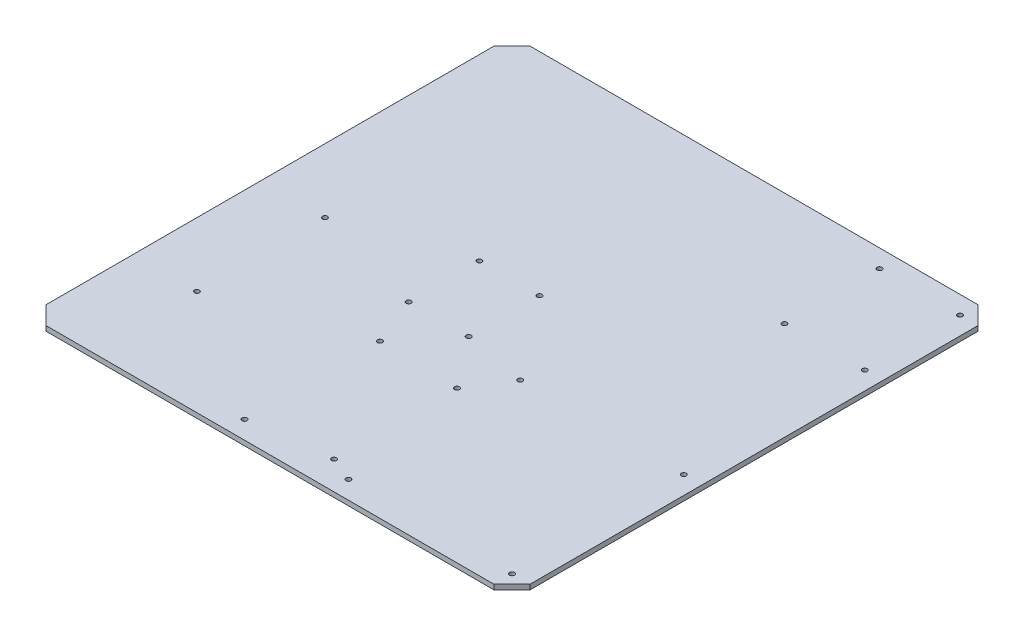
ISO-10303-21;
HEADER;
FILE_DESCRIPTION(('STEP AP214'),'2;1');
FILE_NAME('part.step','',(''),(''),'','','');
FILE_SCHEMA(('AUTOMOTIVE_DESIGN { 1 0 10303 214 1 1 1 1 }'));
ENDSEC;
DATA;
#1=APPLICATION_CONTEXT('core data for automotive mechanical design processes');
#2=APPLICATION_PROTOCOL_DEFINITION('international standard','automotive_design',2000,#1);
#3=PRODUCT_CONTEXT('',#1,'mechanical');
#4=PRODUCT('Part','Part','',(#3));
#5=PRODUCT_RELATED_PRODUCT_CATEGORY('part','',(#4));
#6=PRODUCT_DEFINITION_FORMATION('','',#4);
#7=PRODUCT_DEFINITION_CONTEXT('part definition',#1,'design');
#8=PRODUCT_DEFINITION('design','',#6,#7);
#9=PRODUCT_DEFINITION_SHAPE('','',#8);
#10=(LENGTH_UNIT() NAMED_UNIT(*) SI_UNIT(.MILLI.,.METRE.));
#11=(NAMED_UNIT(*) PLANE_ANGLE_UNIT() SI_UNIT($,.RADIAN.));
#12=(NAMED_UNIT(*) SI_UNIT($,.STERADIAN.) SOLID_ANGLE_UNIT());
#13=UNCERTAINTY_MEASURE_WITH_UNIT(LENGTH_MEASURE(1.E-05),#10,'distance_accuracy_value','');
#14=(GEOMETRIC_REPRESENTATION_CONTEXT(3) GLOBAL_UNCERTAINTY_ASSIGNED_CONTEXT((#13)) GLOBAL_UNIT_ASSIGNED_CONTEXT((#10,
#11,#12)) REPRESENTATION_CONTEXT('',''));
#15=CARTESIAN_POINT('',(0.,0.,0.));
#16=DIRECTION('',(0.,0.,1.));
#17=DIRECTION('',(1.,0.,0.));
#18=AXIS2_PLACEMENT_3D('',#15,#16,#17);
#19=CARTESIAN_POINT('',(0.,1.5,0.));
#20=DIRECTION('',(0.,-1.,0.));
#21=DIRECTION('',(0.,0.,-1.));
#22=AXIS2_PLACEMENT_3D('',#19,#20,#21);
#23=PLANE('',#22);
#24=DIRECTION('',(0.,0.,1.));
#25=VECTOR('',#24,1.);
#26=CARTESIAN_POINT('',(-147.5,1.5,136.500000000001));
#27=LINE('',#26,#25);
#28=CARTESIAN_POINT('',(-147.5,1.5,-136.500000000001));
#29=VERTEX_POINT('',#28);
#30=CARTESIAN_POINT('',(-147.5,1.5,136.500000000001));
#31=VERTEX_POINT('',#30);
#32=EDGE_CURVE('E172',#29,#31,#27,.T.);
#33=ORIENTED_EDGE('',*,*,#32,.T.);
#34=DIRECTION('',(0.707106781186548,0.,0.707106781186548));
#35=VECTOR('',#34,1.);
#36=CARTESIAN_POINT('',(-147.5,1.5,136.500000000001));
#37=LINE('',#36,#35);
#38=CARTESIAN_POINT('',(-136.5,1.5,147.500000000001));
#39=VERTEX_POINT('',#38);
#40=EDGE_CURVE('E206',#31,#39,#37,.T.);
#41=ORIENTED_EDGE('',*,*,#40,.T.);
#42=DIRECTION('',(1.,0.,0.));
#43=VECTOR('',#42,1.);
#44=CARTESIAN_POINT('',(-136.5,1.5,147.500000000001));
#45=LINE('',#44,#43);
#46=CARTESIAN_POINT('',(136.5,1.5,147.500000000001));
#47=VERTEX_POINT('',#46);
#48=EDGE_CURVE('E192',#39,#47,#45,.T.);
#49=ORIENTED_EDGE('',*,*,#48,.T.);
#50=DIRECTION('',(0.707106781186547,0.,-0.707106781186548));
#51=VECTOR('',#50,1.);
#52=CARTESIAN_POINT('',(147.5,1.5,136.500000000001));
#53=LINE('',#52,#51);
#54=CARTESIAN_POINT('',(147.5,1.5,136.500000000001));
#55=VERTEX_POINT('',#54);
#56=EDGE_CURVE('E138',#47,#55,#53,.T.);
#57=ORIENTED_EDGE('',*,*,#56,.T.);
#58=DIRECTION('',(0.,0.,-1.));
#59=VECTOR('',#58,1.);
#60=CARTESIAN_POINT('',(147.5,1.5,136.500000000001));
#61=LINE('',#60,#59);
#62=CARTESIAN_POINT('',(147.5,1.5,-136.500000000001));
#63=VERTEX_POINT('',#62);
#64=EDGE_CURVE('E133',#55,#63,#61,.T.);
#65=ORIENTED_EDGE('',*,*,#64,.T.);
#66=DIRECTION('',(-0.707106781186548,0.,-0.707106781186548));
#67=VECTOR('',#66,1.);
#68=CARTESIAN_POINT('',(136.5,1.5,-147.500000000001));
#69=LINE('',#68,#67);
#70=CARTESIAN_POINT('',(136.5,1.5,-147.500000000001));
#71=VERTEX_POINT('',#70);
#72=EDGE_CURVE('E113',#63,#71,#69,.T.);
#73=ORIENTED_EDGE('',*,*,#72,.T.);
#74=DIRECTION('',(-1.,0.,0.));
#75=VECTOR('',#74,1.);
#76=CARTESIAN_POINT('',(-136.5,1.5,-147.500000000001));
#77=LINE('',#76,#75);
#78=CARTESIAN_POINT('',(-136.5,1.5,-147.500000000001));
#79=VERTEX_POINT('',#78);
#80=EDGE_CURVE('E123',#71,#79,#77,.T.);
#81=ORIENTED_EDGE('',*,*,#80,.T.);
#82=DIRECTION('',(-0.707106781186547,0.,0.707106781186547));
#83=VECTOR('',#82,1.);
#84=CARTESIAN_POINT('',(-147.5,1.5,-136.500000000001));
#85=LINE('',#84,#83);
#86=EDGE_CURVE('E127',#79,#29,#85,.T.);
#87=ORIENTED_EDGE('',*,*,#86,.T.);
#88=EDGE_LOOP('',(#33,#41,#49,#57,#65,#73,#81,#87));
#89=FACE_BOUND('',#88,.T.);
#90=CARTESIAN_POINT('',(-26.5,1.5,136.500000000001));
#91=DIRECTION('',(0.,1.,0.));
#92=DIRECTION('',(0.,0.,1.));
#93=AXIS2_PLACEMENT_3D('',#90,#91,#92);
#94=CIRCLE('',#93,1.5);
#95=CARTESIAN_POINT('',(-26.5,1.5,138.000000000001));
#96=VERTEX_POINT('',#95);
#97=EDGE_CURVE('E148',#96,#96,#94,.T.);
#98=ORIENTED_EDGE('',*,*,#97,.F.);
#99=EDGE_LOOP('',(#98));
#100=FACE_BOUND('',#99,.T.);
#101=CARTESIAN_POINT('',(-26.5,1.5,54.000000000001));
#102=DIRECTION('',(0.,1.,0.));
#103=DIRECTION('',(0.,0.,1.));
#104=AXIS2_PLACEMENT_3D('',#101,#102,#103);
#105=CIRCLE('',#104,1.5);
#106=CARTESIAN_POINT('',(-26.5,1.5,55.500000000001));
#107=VERTEX_POINT('',#106);
#108=EDGE_CURVE('E219',#107,#107,#105,.T.);
#109=ORIENTED_EDGE('',*,*,#108,.F.);
#110=EDGE_LOOP('',(#109));
#111=FACE_BOUND('',#110,.T.);
#112=CARTESIAN_POINT('',(21.7999999999999,1.5,55.3000000000009));
#113=DIRECTION('',(0.,1.,0.));
#114=DIRECTION('',(0.,0.,1.));
#115=AXIS2_PLACEMENT_3D('',#112,#113,#114);
#116=CIRCLE('',#115,1.5);
#117=CARTESIAN_POINT('',(21.7999999999999,1.5,56.8000000000009));
#118=VERTEX_POINT('',#117);
#119=EDGE_CURVE('E227',#118,#118,#116,.T.);
#120=ORIENTED_EDGE('',*,*,#119,.F.);
#121=EDGE_LOOP('',(#120));
#122=FACE_BOUND('',#121,.T.);
#123=CARTESIAN_POINT('',(21.7999999999999,1.5,130.200000000001));
#124=DIRECTION('',(0.,1.,0.));
#125=DIRECTION('',(0.,0.,1.));
#126=AXIS2_PLACEMENT_3D('',#123,#124,#125);
#127=CIRCLE('',#126,1.5);
#128=CARTESIAN_POINT('',(21.7999999999999,1.5,131.700000000001));
#129=VERTEX_POINT('',#128);
#130=EDGE_CURVE('E235',#129,#129,#127,.T.);
#131=ORIENTED_EDGE('',*,*,#130,.F.);
#132=EDGE_LOOP('',(#131));
#133=FACE_BOUND('',#132,.T.);
#134=CARTESIAN_POINT('',(-108.5,1.5,5.49999999999996));
#135=DIRECTION('',(0.,1.,0.));
#136=DIRECTION('',(0.,0.,1.));
#137=AXIS2_PLACEMENT_3D('',#134,#135,#136);
#138=CIRCLE('',#137,1.5);
#139=CARTESIAN_POINT('',(-108.5,1.5,6.99999999999996));
#140=VERTEX_POINT('',#139);
#141=EDGE_CURVE('E243',#140,#140,#138,.T.);
#142=ORIENTED_EDGE('',*,*,#141,.F.);
#143=EDGE_LOOP('',(#142));
#144=FACE_BOUND('',#143,.T.);
#145=CARTESIAN_POINT('',(-108.5,1.5,83.5));
#146=DIRECTION('',(0.,1.,0.));
#147=DIRECTION('',(0.,0.,1.));
#148=AXIS2_PLACEMENT_3D('',#145,#146,#147);
#149=CIRCLE('',#148,1.5);
#150=CARTESIAN_POINT('',(-108.5,1.5,85.));
#151=VERTEX_POINT('',#150);
#152=EDGE_CURVE('E251',#151,#151,#149,.T.);
#153=ORIENTED_EDGE('',*,*,#152,.F.);
#154=EDGE_LOOP('',(#153));
#155=FACE_BOUND('',#154,.T.);
#156=CARTESIAN_POINT('',(-38.5,1.5,24.500000000001));
#157=DIRECTION('',(0.,1.,0.));
#158=DIRECTION('',(0.,0.,1.));
#159=AXIS2_PLACEMENT_3D('',#156,#157,#158);
#160=CIRCLE('',#159,1.5);
#161=CARTESIAN_POINT('',(-38.5,1.5,26.000000000001));
#162=VERTEX_POINT('',#161);
#163=EDGE_CURVE('E259',#162,#162,#160,.T.);
#164=ORIENTED_EDGE('',*,*,#163,.F.);
#165=EDGE_LOOP('',(#164));
#166=FACE_BOUND('',#165,.T.);
#167=CARTESIAN_POINT('',(-1.92000000000005,1.5,-18.679999999999));
#168=DIRECTION('',(0.,1.,0.));
#169=DIRECTION('',(0.,0.,1.));
#170=AXIS2_PLACEMENT_3D('',#167,#168,#169);
#171=CIRCLE('',#170,1.5);
#172=CARTESIAN_POINT('',(-1.92000000000005,1.5,-17.179999999999));
#173=VERTEX_POINT('',#172);
#174=EDGE_CURVE('E267',#173,#173,#171,.T.);
#175=ORIENTED_EDGE('',*,*,#174,.F.);
#176=EDGE_LOOP('',(#175));
#177=FACE_BOUND('',#176,.T.);
#178=CARTESIAN_POINT('',(-38.5,1.5,-18.679999999999));
#179=DIRECTION('',(0.,1.,0.));
#180=DIRECTION('',(0.,0.,1.));
#181=AXIS2_PLACEMENT_3D('',#178,#179,#180);
#182=CIRCLE('',#181,1.5);
#183=CARTESIAN_POINT('',(-38.5,1.5,-17.179999999999));
#184=VERTEX_POINT('',#183);
#185=EDGE_CURVE('E275',#184,#184,#182,.T.);
#186=ORIENTED_EDGE('',*,*,#185,.F.);
#187=EDGE_LOOP('',(#186));
#188=FACE_BOUND('',#187,.T.);
#189=CARTESIAN_POINT('',(-1.92000000000005,1.5,24.500000000001));
#190=DIRECTION('',(0.,1.,0.));
#191=DIRECTION('',(0.,0.,1.));
#192=AXIS2_PLACEMENT_3D('',#189,#190,#191);
#193=CIRCLE('',#192,1.5);
#194=CARTESIAN_POINT('',(-1.92000000000005,1.5,26.000000000001));
#195=VERTEX_POINT('',#194);
#196=EDGE_CURVE('E283',#195,#195,#193,.T.);
#197=ORIENTED_EDGE('',*,*,#196,.F.);
#198=EDGE_LOOP('',(#197));
#199=FACE_BOUND('',#198,.T.);
#200=CARTESIAN_POINT('',(136.5,1.5,-136.500000000001));
#201=DIRECTION('',(0.,1.,0.));
#202=DIRECTION('',(0.,0.,1.));
#203=AXIS2_PLACEMENT_3D('',#200,#201,#202);
#204=CIRCLE('',#203,1.5);
#205=CARTESIAN_POINT('',(136.5,1.5,-135.000000000001));
#206=VERTEX_POINT('',#205);
#207=EDGE_CURVE('E291',#206,#206,#204,.T.);
#208=ORIENTED_EDGE('',*,*,#207,.F.);
#209=EDGE_LOOP('',(#208));
#210=FACE_BOUND('',#209,.T.);
#211=CARTESIAN_POINT('',(87.4999999999999,1.5,-136.500000000001));
#212=DIRECTION('',(0.,1.,0.));
#213=DIRECTION('',(0.,0.,1.));
#214=AXIS2_PLACEMENT_3D('',#211,#212,#213);
#215=CIRCLE('',#214,1.4999999999998);
#216=CARTESIAN_POINT('',(87.4999999999999,1.5,-135.000000000001));
#217=VERTEX_POINT('',#216);
#218=EDGE_CURVE('E299',#217,#217,#215,.T.);
#219=ORIENTED_EDGE('',*,*,#218,.F.);
#220=EDGE_LOOP('',(#219));
#221=FACE_BOUND('',#220,.T.);
#222=CARTESIAN_POINT('',(87.4999999999999,1.5,-78.500000000001));
#223=DIRECTION('',(0.,1.,0.));
#224=DIRECTION('',(0.,0.,1.));
#225=AXIS2_PLACEMENT_3D('',#222,#223,#224);
#226=CIRCLE('',#225,1.4999999999998);
#227=CARTESIAN_POINT('',(87.4999999999999,1.5,-77.0000000000013));
#228=VERTEX_POINT('',#227);
#229=EDGE_CURVE('E307',#228,#228,#226,.T.);
#230=ORIENTED_EDGE('',*,*,#229,.F.);
#231=EDGE_LOOP('',(#230));
#232=FACE_BOUND('',#231,.T.);
#233=CARTESIAN_POINT('',(136.5,1.5,-78.500000000001));
#234=DIRECTION('',(0.,1.,0.));
#235=DIRECTION('',(0.,0.,1.));
#236=AXIS2_PLACEMENT_3D('',#233,#234,#235);
#237=CIRCLE('',#236,1.5);
#238=CARTESIAN_POINT('',(136.5,1.5,-77.000000000001));
#239=VERTEX_POINT('',#238);
#240=EDGE_CURVE('E315',#239,#239,#237,.T.);
#241=ORIENTED_EDGE('',*,*,#240,.F.);
#242=EDGE_LOOP('',(#241));
#243=FACE_BOUND('',#242,.T.);
#244=CARTESIAN_POINT('',(136.5,1.5,136.500000000001));
#245=DIRECTION('',(0.,1.,0.));
#246=DIRECTION('',(0.,0.,1.));
#247=AXIS2_PLACEMENT_3D('',#244,#245,#246);
#248=CIRCLE('',#247,1.5);
#249=CARTESIAN_POINT('',(136.5,1.5,138.000000000001));
#250=VERTEX_POINT('',#249);
#251=EDGE_CURVE('E323',#250,#250,#248,.T.);
#252=ORIENTED_EDGE('',*,*,#251,.F.);
#253=EDGE_LOOP('',(#252));
#254=FACE_BOUND('',#253,.T.);
#255=CARTESIAN_POINT('',(36.7999999999999,1.5,136.500000000001));
#256=DIRECTION('',(0.,1.,0.));
#257=DIRECTION('',(0.,0.,1.));
#258=AXIS2_PLACEMENT_3D('',#255,#256,#257);
#259=CIRCLE('',#258,1.5);
#260=CARTESIAN_POINT('',(36.7999999999999,1.5,138.000000000001));
#261=VERTEX_POINT('',#260);
#262=EDGE_CURVE('E331',#261,#261,#259,.T.);
#263=ORIENTED_EDGE('',*,*,#262,.F.);
#264=EDGE_LOOP('',(#263));
#265=FACE_BOUND('',#264,.T.);
#266=CARTESIAN_POINT('',(36.7999999999999,1.5,31.800000000001));
#267=DIRECTION('',(0.,1.,0.));
#268=DIRECTION('',(0.,0.,1.));
#269=AXIS2_PLACEMENT_3D('',#266,#267,#268);
#270=CIRCLE('',#269,1.5);
#271=CARTESIAN_POINT('',(36.7999999999999,1.5,33.3000000000009));
#272=VERTEX_POINT('',#271);
#273=EDGE_CURVE('E339',#272,#272,#270,.T.);
#274=ORIENTED_EDGE('',*,*,#273,.F.);
#275=EDGE_LOOP('',(#274));
#276=FACE_BOUND('',#275,.T.);
#277=CARTESIAN_POINT('',(136.5,1.5,31.800000000001));
#278=DIRECTION('',(0.,1.,0.));
#279=DIRECTION('',(0.,0.,1.));
#280=AXIS2_PLACEMENT_3D('',#277,#278,#279);
#281=CIRCLE('',#280,1.5);
#282=CARTESIAN_POINT('',(136.5,1.5,33.3000000000009));
#283=VERTEX_POINT('',#282);
#284=EDGE_CURVE('E347',#283,#283,#281,.T.);
#285=ORIENTED_EDGE('',*,*,#284,.F.);
#286=EDGE_LOOP('',(#285));
#287=FACE_BOUND('',#286,.T.);
#288=ADVANCED_FACE('F41',(#89,#100,#111,#122,#133,#144,#155,#166,#177,#188,#199,#210,#221,#232,
#243,#254,#265,#276,#287),#23,.F.);
#289=CARTESIAN_POINT('',(0.,-1.5,0.));
#290=DIRECTION('',(0.,-1.,0.));
#291=DIRECTION('',(0.,0.,-1.));
#292=AXIS2_PLACEMENT_3D('',#289,#290,#291);
#293=PLANE('',#292);
#294=CARTESIAN_POINT('',(36.7999999999999,-1.5,31.800000000001));
#295=DIRECTION('',(0.,1.,0.));
#296=DIRECTION('',(0.,0.,1.));
#297=AXIS2_PLACEMENT_3D('',#294,#295,#296);
#298=CIRCLE('',#297,1.5);
#299=CARTESIAN_POINT('',(36.7999999999999,-1.5,33.3000000000009));
#300=VERTEX_POINT('',#299);
#301=EDGE_CURVE('E343',#300,#300,#298,.T.);
#302=ORIENTED_EDGE('',*,*,#301,.T.);
#303=EDGE_LOOP('',(#302));
#304=FACE_BOUND('',#303,.T.);
#305=CARTESIAN_POINT('',(136.5,-1.5,136.500000000001));
#306=DIRECTION('',(0.,1.,0.));
#307=DIRECTION('',(0.,0.,1.));
#308=AXIS2_PLACEMENT_3D('',#305,#306,#307);
#309=CIRCLE('',#308,1.5);
#310=CARTESIAN_POINT('',(136.5,-1.5,138.000000000001));
#311=VERTEX_POINT('',#310);
#312=EDGE_CURVE('E327',#311,#311,#309,.T.);
#313=ORIENTED_EDGE('',*,*,#312,.T.);
#314=EDGE_LOOP('',(#313));
#315=FACE_BOUND('',#314,.T.);
#316=CARTESIAN_POINT('',(87.4999999999999,-1.5,-78.500000000001));
#317=DIRECTION('',(0.,1.,0.));
#318=DIRECTION('',(0.,0.,1.));
#319=AXIS2_PLACEMENT_3D('',#316,#317,#318);
#320=CIRCLE('',#319,1.4999999999998);
#321=CARTESIAN_POINT('',(87.4999999999999,-1.5,-77.0000000000013));
#322=VERTEX_POINT('',#321);
#323=EDGE_CURVE('E311',#322,#322,#320,.T.);
#324=ORIENTED_EDGE('',*,*,#323,.T.);
#325=EDGE_LOOP('',(#324));
#326=FACE_BOUND('',#325,.T.);
#327=CARTESIAN_POINT('',(136.5,-1.5,-136.500000000001));
#328=DIRECTION('',(0.,1.,0.));
#329=DIRECTION('',(0.,0.,1.));
#330=AXIS2_PLACEMENT_3D('',#327,#328,#329);
#331=CIRCLE('',#330,1.5);
#332=CARTESIAN_POINT('',(136.5,-1.5,-135.000000000001));
#333=VERTEX_POINT('',#332);
#334=EDGE_CURVE('E295',#333,#333,#331,.T.);
#335=ORIENTED_EDGE('',*,*,#334,.T.);
#336=EDGE_LOOP('',(#335));
#337=FACE_BOUND('',#336,.T.);
#338=CARTESIAN_POINT('',(-38.5,-1.5,-18.679999999999));
#339=DIRECTION('',(0.,1.,0.));
#340=DIRECTION('',(0.,0.,1.));
#341=AXIS2_PLACEMENT_3D('',#338,#339,#340);
#342=CIRCLE('',#341,1.5);
#343=CARTESIAN_POINT('',(-38.5,-1.5,-17.179999999999));
#344=VERTEX_POINT('',#343);
#345=EDGE_CURVE('E279',#344,#344,#342,.T.);
#346=ORIENTED_EDGE('',*,*,#345,.T.);
#347=EDGE_LOOP('',(#346));
#348=FACE_BOUND('',#347,.T.);
#349=CARTESIAN_POINT('',(-38.5,-1.5,24.500000000001));
#350=DIRECTION('',(0.,1.,0.));
#351=DIRECTION('',(0.,0.,1.));
#352=AXIS2_PLACEMENT_3D('',#349,#350,#351);
#353=CIRCLE('',#352,1.5);
#354=CARTESIAN_POINT('',(-38.5,-1.5,26.000000000001));
#355=VERTEX_POINT('',#354);
#356=EDGE_CURVE('E263',#355,#355,#353,.T.);
#357=ORIENTED_EDGE('',*,*,#356,.T.);
#358=EDGE_LOOP('',(#357));
#359=FACE_BOUND('',#358,.T.);
#360=CARTESIAN_POINT('',(-108.5,-1.5,5.49999999999996));
#361=DIRECTION('',(0.,1.,0.));
#362=DIRECTION('',(0.,0.,1.));
#363=AXIS2_PLACEMENT_3D('',#360,#361,#362);
#364=CIRCLE('',#363,1.5);
#365=CARTESIAN_POINT('',(-108.5,-1.5,6.99999999999996));
#366=VERTEX_POINT('',#365);
#367=EDGE_CURVE('E247',#366,#366,#364,.T.);
#368=ORIENTED_EDGE('',*,*,#367,.T.);
#369=EDGE_LOOP('',(#368));
#370=FACE_BOUND('',#369,.T.);
#371=CARTESIAN_POINT('',(21.7999999999999,-1.5,55.3000000000009));
#372=DIRECTION('',(0.,1.,0.));
#373=DIRECTION('',(0.,0.,1.));
#374=AXIS2_PLACEMENT_3D('',#371,#372,#373);
#375=CIRCLE('',#374,1.5);
#376=CARTESIAN_POINT('',(21.7999999999999,-1.5,56.8000000000009));
#377=VERTEX_POINT('',#376);
#378=EDGE_CURVE('E231',#377,#377,#375,.T.);
#379=ORIENTED_EDGE('',*,*,#378,.T.);
#380=EDGE_LOOP('',(#379));
#381=FACE_BOUND('',#380,.T.);
#382=CARTESIAN_POINT('',(-26.5,-1.5,136.500000000001));
#383=DIRECTION('',(0.,1.,0.));
#384=DIRECTION('',(0.,0.,1.));
#385=AXIS2_PLACEMENT_3D('',#382,#383,#384);
#386=CIRCLE('',#385,1.5);
#387=CARTESIAN_POINT('',(-26.5,-1.5,138.000000000001));
#388=VERTEX_POINT('',#387);
#389=EDGE_CURVE('E215',#388,#388,#386,.T.);
#390=ORIENTED_EDGE('',*,*,#389,.T.);
#391=EDGE_LOOP('',(#390));
#392=FACE_BOUND('',#391,.T.);
#393=DIRECTION('',(0.,0.,1.));
#394=VECTOR('',#393,1.);
#395=CARTESIAN_POINT('',(-147.5,-1.5,136.500000000001));
#396=LINE('',#395,#394);
#397=CARTESIAN_POINT('',(-147.5,-1.5,-136.500000000001));
#398=VERTEX_POINT('',#397);
#399=CARTESIAN_POINT('',(-147.5,-1.5,136.500000000001));
#400=VERTEX_POINT('',#399);
#401=EDGE_CURVE('E144',#398,#400,#396,.T.);
#402=ORIENTED_EDGE('',*,*,#401,.F.);
#403=DIRECTION('',(-0.707106781186547,0.,0.707106781186547));
#404=VECTOR('',#403,1.);
#405=CARTESIAN_POINT('',(-147.5,-1.5,-136.500000000001));
#406=LINE('',#405,#404);
#407=CARTESIAN_POINT('',(-136.5,-1.5,-147.500000000001));
#408=VERTEX_POINT('',#407);
#409=EDGE_CURVE('E169',#408,#398,#406,.T.);
#410=ORIENTED_EDGE('',*,*,#409,.F.);
#411=DIRECTION('',(-1.,0.,0.));
#412=VECTOR('',#411,1.);
#413=CARTESIAN_POINT('',(-136.5,-1.5,-147.500000000001));
#414=LINE('',#413,#412);
#415=CARTESIAN_POINT('',(136.5,-1.5,-147.500000000001));
#416=VERTEX_POINT('',#415);
#417=EDGE_CURVE('E166',#416,#408,#414,.T.);
#418=ORIENTED_EDGE('',*,*,#417,.F.);
#419=DIRECTION('',(-0.707106781186548,0.,-0.707106781186548));
#420=VECTOR('',#419,1.);
#421=CARTESIAN_POINT('',(136.5,-1.5,-147.500000000001));
#422=LINE('',#421,#420);
#423=CARTESIAN_POINT('',(147.5,-1.5,-136.500000000001));
#424=VERTEX_POINT('',#423);
#425=EDGE_CURVE('E116',#424,#416,#422,.T.);
#426=ORIENTED_EDGE('',*,*,#425,.F.);
#427=DIRECTION('',(0.,0.,-1.));
#428=VECTOR('',#427,1.);
#429=CARTESIAN_POINT('',(147.5,-1.5,136.500000000001));
#430=LINE('',#429,#428);
#431=CARTESIAN_POINT('',(147.5,-1.5,136.500000000001));
#432=VERTEX_POINT('',#431);
#433=EDGE_CURVE('E160',#432,#424,#430,.T.);
#434=ORIENTED_EDGE('',*,*,#433,.F.);
#435=DIRECTION('',(0.707106781186547,0.,-0.707106781186548));
#436=VECTOR('',#435,1.);
#437=CARTESIAN_POINT('',(147.5,-1.5,136.500000000001));
#438=LINE('',#437,#436);
#439=CARTESIAN_POINT('',(136.5,-1.5,147.500000000001));
#440=VERTEX_POINT('',#439);
#441=EDGE_CURVE('E156',#440,#432,#438,.T.);
#442=ORIENTED_EDGE('',*,*,#441,.F.);
#443=DIRECTION('',(1.,0.,0.));
#444=VECTOR('',#443,1.);
#445=CARTESIAN_POINT('',(-136.5,-1.5,147.500000000001));
#446=LINE('',#445,#444);
#447=CARTESIAN_POINT('',(-136.5,-1.5,147.500000000001));
#448=VERTEX_POINT('',#447);
#449=EDGE_CURVE('E152',#448,#440,#446,.T.);
#450=ORIENTED_EDGE('',*,*,#449,.F.);
#451=DIRECTION('',(0.707106781186548,0.,0.707106781186548));
#452=VECTOR('',#451,1.);
#453=CARTESIAN_POINT('',(-147.5,-1.5,136.500000000001));
#454=LINE('',#453,#452);
#455=EDGE_CURVE('E147',#400,#448,#454,.T.);
#456=ORIENTED_EDGE('',*,*,#455,.F.);
#457=EDGE_LOOP('',(#402,#410,#418,#426,#434,#442,#450,#456));
#458=FACE_BOUND('',#457,.T.);
#459=CARTESIAN_POINT('',(-26.5,-1.5,54.000000000001));
#460=DIRECTION('',(0.,1.,0.));
#461=DIRECTION('',(0.,0.,1.));
#462=AXIS2_PLACEMENT_3D('',#459,#460,#461);
#463=CIRCLE('',#462,1.5);
#464=CARTESIAN_POINT('',(-26.5,-1.5,55.500000000001));
#465=VERTEX_POINT('',#464);
#466=EDGE_CURVE('E223',#465,#465,#463,.T.);
#467=ORIENTED_EDGE('',*,*,#466,.T.);
#468=EDGE_LOOP('',(#467));
#469=FACE_BOUND('',#468,.T.);
#470=CARTESIAN_POINT('',(21.7999999999999,-1.5,130.200000000001));
#471=DIRECTION('',(0.,1.,0.));
#472=DIRECTION('',(0.,0.,1.));
#473=AXIS2_PLACEMENT_3D('',#470,#471,#472);
#474=CIRCLE('',#473,1.5);
#475=CARTESIAN_POINT('',(21.7999999999999,-1.5,131.700000000001));
#476=VERTEX_POINT('',#475);
#477=EDGE_CURVE('E239',#476,#476,#474,.T.);
#478=ORIENTED_EDGE('',*,*,#477,.T.);
#479=EDGE_LOOP('',(#478));
#480=FACE_BOUND('',#479,.T.);
#481=CARTESIAN_POINT('',(-108.5,-1.5,83.5));
#482=DIRECTION('',(0.,1.,0.));
#483=DIRECTION('',(0.,0.,1.));
#484=AXIS2_PLACEMENT_3D('',#481,#482,#483);
#485=CIRCLE('',#484,1.5);
#486=CARTESIAN_POINT('',(-108.5,-1.5,85.));
#487=VERTEX_POINT('',#486);
#488=EDGE_CURVE('E255',#487,#487,#485,.T.);
#489=ORIENTED_EDGE('',*,*,#488,.T.);
#490=EDGE_LOOP('',(#489));
#491=FACE_BOUND('',#490,.T.);
#492=CARTESIAN_POINT('',(-1.92000000000005,-1.5,-18.679999999999));
#493=DIRECTION('',(0.,1.,0.));
#494=DIRECTION('',(0.,0.,1.));
#495=AXIS2_PLACEMENT_3D('',#492,#493,#494);
#496=CIRCLE('',#495,1.5);
#497=CARTESIAN_POINT('',(-1.92000000000005,-1.5,-17.179999999999));
#498=VERTEX_POINT('',#497);
#499=EDGE_CURVE('E271',#498,#498,#496,.T.);
#500=ORIENTED_EDGE('',*,*,#499,.T.);
#501=EDGE_LOOP('',(#500));
#502=FACE_BOUND('',#501,.T.);
#503=CARTESIAN_POINT('',(-1.92000000000005,-1.5,24.500000000001));
#504=DIRECTION('',(0.,1.,0.));
#505=DIRECTION('',(0.,0.,1.));
#506=AXIS2_PLACEMENT_3D('',#503,#504,#505);
#507=CIRCLE('',#506,1.5);
#508=CARTESIAN_POINT('',(-1.92000000000005,-1.5,26.000000000001));
#509=VERTEX_POINT('',#508);
#510=EDGE_CURVE('E287',#509,#509,#507,.T.);
#511=ORIENTED_EDGE('',*,*,#510,.T.);
#512=EDGE_LOOP('',(#511));
#513=FACE_BOUND('',#512,.T.);
#514=CARTESIAN_POINT('',(87.4999999999999,-1.5,-136.500000000001));
#515=DIRECTION('',(0.,1.,0.));
#516=DIRECTION('',(0.,0.,1.));
#517=AXIS2_PLACEMENT_3D('',#514,#515,#516);
#518=CIRCLE('',#517,1.4999999999998);
#519=CARTESIAN_POINT('',(87.4999999999999,-1.5,-135.000000000001));
#520=VERTEX_POINT('',#519);
#521=EDGE_CURVE('E303',#520,#520,#518,.T.);
#522=ORIENTED_EDGE('',*,*,#521,.T.);
#523=EDGE_LOOP('',(#522));
#524=FACE_BOUND('',#523,.T.);
#525=CARTESIAN_POINT('',(136.5,-1.5,-78.500000000001));
#526=DIRECTION('',(0.,1.,0.));
#527=DIRECTION('',(0.,0.,1.));
#528=AXIS2_PLACEMENT_3D('',#525,#526,#527);
#529=CIRCLE('',#528,1.5);
#530=CARTESIAN_POINT('',(136.5,-1.5,-77.000000000001));
#531=VERTEX_POINT('',#530);
#532=EDGE_CURVE('E319',#531,#531,#529,.T.);
#533=ORIENTED_EDGE('',*,*,#532,.T.);
#534=EDGE_LOOP('',(#533));
#535=FACE_BOUND('',#534,.T.);
#536=CARTESIAN_POINT('',(36.7999999999999,-1.5,136.500000000001));
#537=DIRECTION('',(0.,1.,0.));
#538=DIRECTION('',(0.,0.,1.));
#539=AXIS2_PLACEMENT_3D('',#536,#537,#538);
#540=CIRCLE('',#539,1.5);
#541=CARTESIAN_POINT('',(36.7999999999999,-1.5,138.000000000001));
#542=VERTEX_POINT('',#541);
#543=EDGE_CURVE('E335',#542,#542,#540,.T.);
#544=ORIENTED_EDGE('',*,*,#543,.T.);
#545=EDGE_LOOP('',(#544));
#546=FACE_BOUND('',#545,.T.);
#547=CARTESIAN_POINT('',(136.5,-1.5,31.800000000001));
#548=DIRECTION('',(0.,1.,0.));
#549=DIRECTION('',(0.,0.,1.));
#550=AXIS2_PLACEMENT_3D('',#547,#548,#549);
#551=CIRCLE('',#550,1.5);
#552=CARTESIAN_POINT('',(136.5,-1.5,33.3000000000009));
#553=VERTEX_POINT('',#552);
#554=EDGE_CURVE('E351',#553,#553,#551,.T.);
#555=ORIENTED_EDGE('',*,*,#554,.T.);
#556=EDGE_LOOP('',(#555));
#557=FACE_BOUND('',#556,.T.);
#558=ADVANCED_FACE('F199',(#304,#315,#326,#337,#348,#359,#370,#381,#392,#458,#469,#480,#491,
#502,#513,#524,#535,#546,#557),#293,.T.);
#559=CARTESIAN_POINT('',(-147.5,1.5,136.500000000001));
#560=DIRECTION('',(1.,0.,0.));
#561=DIRECTION('',(0.,0.,-1.));
#562=AXIS2_PLACEMENT_3D('',#559,#560,#561);
#563=PLANE('',#562);
#564=ORIENTED_EDGE('',*,*,#401,.T.);
#565=DIRECTION('',(0.,-1.,0.));
#566=VECTOR('',#565,1.);
#567=CARTESIAN_POINT('',(-147.5,1.5,136.500000000001));
#568=LINE('',#567,#566);
#569=EDGE_CURVE('E11',#31,#400,#568,.T.);
#570=ORIENTED_EDGE('',*,*,#569,.F.);
#571=ORIENTED_EDGE('',*,*,#32,.F.);
#572=DIRECTION('',(0.,-1.,0.));
#573=VECTOR('',#572,1.);
#574=CARTESIAN_POINT('',(-147.5,1.5,-136.500000000001));
#575=LINE('',#574,#573);
#576=EDGE_CURVE('E59',#29,#398,#575,.T.);
#577=ORIENTED_EDGE('',*,*,#576,.T.);
#578=EDGE_LOOP('',(#564,#570,#571,#577));
#579=FACE_BOUND('',#578,.T.);
#580=ADVANCED_FACE('F43',(#579),#563,.F.);
#581=CARTESIAN_POINT('',(-147.5,1.5,136.500000000001));
#582=DIRECTION('',(0.707106781186547,0.,-0.707106781186547));
#583=DIRECTION('',(-0.707106781186548,0.,-0.707106781186548));
#584=AXIS2_PLACEMENT_3D('',#581,#582,#583);
#585=PLANE('',#584);
#586=ORIENTED_EDGE('',*,*,#455,.T.);
#587=DIRECTION('',(0.,-1.,0.));
#588=VECTOR('',#587,1.);
#589=CARTESIAN_POINT('',(-136.5,1.5,147.500000000001));
#590=LINE('',#589,#588);
#591=EDGE_CURVE('E51',#39,#448,#590,.T.);
#592=ORIENTED_EDGE('',*,*,#591,.F.);
#593=ORIENTED_EDGE('',*,*,#40,.F.);
#594=ORIENTED_EDGE('',*,*,#569,.T.);
#595=EDGE_LOOP('',(#586,#592,#593,#594));
#596=FACE_BOUND('',#595,.T.);
#597=ADVANCED_FACE('F196',(#596),#585,.F.);
#598=CARTESIAN_POINT('',(-136.5,1.5,147.500000000001));
#599=DIRECTION('',(0.,0.,-1.));
#600=DIRECTION('',(-1.,0.,0.));
#601=AXIS2_PLACEMENT_3D('',#598,#599,#600);
#602=PLANE('',#601);
#603=ORIENTED_EDGE('',*,*,#449,.T.);
#604=DIRECTION('',(0.,-1.,0.));
#605=VECTOR('',#604,1.);
#606=CARTESIAN_POINT('',(136.5,1.5,147.500000000001));
#607=LINE('',#606,#605);
#608=EDGE_CURVE('E182',#47,#440,#607,.T.);
#609=ORIENTED_EDGE('',*,*,#608,.F.);
#610=ORIENTED_EDGE('',*,*,#48,.F.);
#611=ORIENTED_EDGE('',*,*,#591,.T.);
#612=EDGE_LOOP('',(#603,#609,#610,#611));
#613=FACE_BOUND('',#612,.T.);
#614=ADVANCED_FACE('F188',(#613),#602,.F.);
#615=CARTESIAN_POINT('',(147.5,1.5,136.500000000001));
#616=DIRECTION('',(-0.707106781186548,0.,-0.707106781186547));
#617=DIRECTION('',(-0.707106781186547,0.,0.707106781186548));
#618=AXIS2_PLACEMENT_3D('',#615,#616,#617);
#619=PLANE('',#618);
#620=ORIENTED_EDGE('',*,*,#441,.T.);
#621=DIRECTION('',(0.,-1.,0.));
#622=VECTOR('',#621,1.);
#623=CARTESIAN_POINT('',(147.5,1.5,136.500000000001));
#624=LINE('',#623,#622);
#625=EDGE_CURVE('E179',#55,#432,#624,.T.);
#626=ORIENTED_EDGE('',*,*,#625,.F.);
#627=ORIENTED_EDGE('',*,*,#56,.F.);
#628=ORIENTED_EDGE('',*,*,#608,.T.);
#629=EDGE_LOOP('',(#620,#626,#627,#628));
#630=FACE_BOUND('',#629,.T.);
#631=ADVANCED_FACE('F203',(#630),#619,.F.);
#632=CARTESIAN_POINT('',(147.5,1.5,136.500000000001));
#633=DIRECTION('',(-1.,0.,0.));
#634=DIRECTION('',(0.,0.,1.));
#635=AXIS2_PLACEMENT_3D('',#632,#633,#634);
#636=PLANE('',#635);
#637=ORIENTED_EDGE('',*,*,#433,.T.);
#638=DIRECTION('',(0.,-1.,0.));
#639=VECTOR('',#638,1.);
#640=CARTESIAN_POINT('',(147.5,1.5,-136.500000000001));
#641=LINE('',#640,#639);
#642=EDGE_CURVE('E120',#63,#424,#641,.T.);
#643=ORIENTED_EDGE('',*,*,#642,.F.);
#644=ORIENTED_EDGE('',*,*,#64,.F.);
#645=ORIENTED_EDGE('',*,*,#625,.T.);
#646=EDGE_LOOP('',(#637,#643,#644,#645));
#647=FACE_BOUND('',#646,.T.);
#648=ADVANCED_FACE('F382',(#647),#636,.F.);
#649=CARTESIAN_POINT('',(136.5,1.5,-147.500000000001));
#650=DIRECTION('',(-0.707106781186547,0.,0.707106781186547));
#651=DIRECTION('',(0.707106781186548,0.,0.707106781186548));
#652=AXIS2_PLACEMENT_3D('',#649,#650,#651);
#653=PLANE('',#652);
#654=ORIENTED_EDGE('',*,*,#425,.T.);
#655=DIRECTION('',(0.,-1.,0.));
#656=VECTOR('',#655,1.);
#657=CARTESIAN_POINT('',(136.5,1.5,-147.500000000001));
#658=LINE('',#657,#656);
#659=EDGE_CURVE('E109',#71,#416,#658,.T.);
#660=ORIENTED_EDGE('',*,*,#659,.F.);
#661=ORIENTED_EDGE('',*,*,#72,.F.);
#662=ORIENTED_EDGE('',*,*,#642,.T.);
#663=EDGE_LOOP('',(#654,#660,#661,#662));
#664=FACE_BOUND('',#663,.T.);
#665=ADVANCED_FACE('F111',(#664),#653,.F.);
#666=CARTESIAN_POINT('',(-136.5,1.5,-147.500000000001));
#667=DIRECTION('',(0.,0.,1.));
#668=DIRECTION('',(1.,0.,0.));
#669=AXIS2_PLACEMENT_3D('',#666,#667,#668);
#670=PLANE('',#669);
#671=ORIENTED_EDGE('',*,*,#417,.T.);
#672=DIRECTION('',(0.,-1.,0.));
#673=VECTOR('',#672,1.);
#674=CARTESIAN_POINT('',(-136.5,1.5,-147.500000000001));
#675=LINE('',#674,#673);
#676=EDGE_CURVE('E84',#79,#408,#675,.T.);
#677=ORIENTED_EDGE('',*,*,#676,.F.);
#678=ORIENTED_EDGE('',*,*,#80,.F.);
#679=ORIENTED_EDGE('',*,*,#659,.T.);
#680=EDGE_LOOP('',(#671,#677,#678,#679));
#681=FACE_BOUND('',#680,.T.);
#682=ADVANCED_FACE('F124',(#681),#670,.F.);
#683=CARTESIAN_POINT('',(-147.5,1.5,-136.500000000001));
#684=DIRECTION('',(0.707106781186548,0.,0.707106781186548));
#685=DIRECTION('',(0.707106781186548,0.,-0.707106781186548));
#686=AXIS2_PLACEMENT_3D('',#683,#684,#685);
#687=PLANE('',#686);
#688=ORIENTED_EDGE('',*,*,#409,.T.);
#689=ORIENTED_EDGE('',*,*,#576,.F.);
#690=ORIENTED_EDGE('',*,*,#86,.F.);
#691=ORIENTED_EDGE('',*,*,#676,.T.);
#692=EDGE_LOOP('',(#688,#689,#690,#691));
#693=FACE_BOUND('',#692,.T.);
#694=ADVANCED_FACE('F375',(#693),#687,.F.);
#695=CARTESIAN_POINT('',(-26.5,1.5,136.500000000001));
#696=DIRECTION('',(0.,-1.,0.));
#697=DIRECTION('',(0.,0.,-1.));
#698=AXIS2_PLACEMENT_3D('',#695,#696,#697);
#699=CYLINDRICAL_SURFACE('',#698,1.5);
#700=ORIENTED_EDGE('',*,*,#97,.T.);
#701=EDGE_LOOP('',(#700));
#702=FACE_BOUND('',#701,.T.);
#703=ORIENTED_EDGE('',*,*,#389,.F.);
#704=EDGE_LOOP('',(#703));
#705=FACE_BOUND('',#704,.T.);
#706=ADVANCED_FACE('F372',(#702,#705),#699,.F.);
#707=CARTESIAN_POINT('',(-26.5,1.5,54.000000000001));
#708=DIRECTION('',(0.,-1.,0.));
#709=DIRECTION('',(0.,0.,-1.));
#710=AXIS2_PLACEMENT_3D('',#707,#708,#709);
#711=CYLINDRICAL_SURFACE('',#710,1.5);
#712=ORIENTED_EDGE('',*,*,#108,.T.);
#713=EDGE_LOOP('',(#712));
#714=FACE_BOUND('',#713,.T.);
#715=ORIENTED_EDGE('',*,*,#466,.F.);
#716=EDGE_LOOP('',(#715));
#717=FACE_BOUND('',#716,.T.);
#718=ADVANCED_FACE('F433',(#714,#717),#711,.F.);
#719=CARTESIAN_POINT('',(21.7999999999999,1.5,55.3000000000009));
#720=DIRECTION('',(0.,-1.,0.));
#721=DIRECTION('',(0.,0.,-1.));
#722=AXIS2_PLACEMENT_3D('',#719,#720,#721);
#723=CYLINDRICAL_SURFACE('',#722,1.5);
#724=ORIENTED_EDGE('',*,*,#119,.T.);
#725=EDGE_LOOP('',(#724));
#726=FACE_BOUND('',#725,.T.);
#727=ORIENTED_EDGE('',*,*,#378,.F.);
#728=EDGE_LOOP('',(#727));
#729=FACE_BOUND('',#728,.T.);
#730=ADVANCED_FACE('F440',(#726,#729),#723,.F.);
#731=CARTESIAN_POINT('',(21.7999999999999,1.5,130.200000000001));
#732=DIRECTION('',(0.,-1.,0.));
#733=DIRECTION('',(0.,0.,-1.));
#734=AXIS2_PLACEMENT_3D('',#731,#732,#733);
#735=CYLINDRICAL_SURFACE('',#734,1.5);
#736=ORIENTED_EDGE('',*,*,#130,.T.);
#737=EDGE_LOOP('',(#736));
#738=FACE_BOUND('',#737,.T.);
#739=ORIENTED_EDGE('',*,*,#477,.F.);
#740=EDGE_LOOP('',(#739));
#741=FACE_BOUND('',#740,.T.);
#742=ADVANCED_FACE('F447',(#738,#741),#735,.F.);
#743=CARTESIAN_POINT('',(-108.5,1.5,5.49999999999996));
#744=DIRECTION('',(0.,-1.,0.));
#745=DIRECTION('',(0.,0.,-1.));
#746=AXIS2_PLACEMENT_3D('',#743,#744,#745);
#747=CYLINDRICAL_SURFACE('',#746,1.5);
#748=ORIENTED_EDGE('',*,*,#141,.T.);
#749=EDGE_LOOP('',(#748));
#750=FACE_BOUND('',#749,.T.);
#751=ORIENTED_EDGE('',*,*,#367,.F.);
#752=EDGE_LOOP('',(#751));
#753=FACE_BOUND('',#752,.T.);
#754=ADVANCED_FACE('F455',(#750,#753),#747,.F.);
#755=CARTESIAN_POINT('',(-108.5,1.5,83.5));
#756=DIRECTION('',(0.,-1.,0.));
#757=DIRECTION('',(0.,0.,-1.));
#758=AXIS2_PLACEMENT_3D('',#755,#756,#757);
#759=CYLINDRICAL_SURFACE('',#758,1.5);
#760=ORIENTED_EDGE('',*,*,#152,.T.);
#761=EDGE_LOOP('',(#760));
#762=FACE_BOUND('',#761,.T.);
#763=ORIENTED_EDGE('',*,*,#488,.F.);
#764=EDGE_LOOP('',(#763));
#765=FACE_BOUND('',#764,.T.);
#766=ADVANCED_FACE('F463',(#762,#765),#759,.F.);
#767=CARTESIAN_POINT('',(-38.5,1.5,24.500000000001));
#768=DIRECTION('',(0.,-1.,0.));
#769=DIRECTION('',(0.,0.,-1.));
#770=AXIS2_PLACEMENT_3D('',#767,#768,#769);
#771=CYLINDRICAL_SURFACE('',#770,1.5);
#772=ORIENTED_EDGE('',*,*,#163,.T.);
#773=EDGE_LOOP('',(#772));
#774=FACE_BOUND('',#773,.T.);
#775=ORIENTED_EDGE('',*,*,#356,.F.);
#776=EDGE_LOOP('',(#775));
#777=FACE_BOUND('',#776,.T.);
#778=ADVANCED_FACE('F471',(#774,#777),#771,.F.);
#779=CARTESIAN_POINT('',(-1.92000000000005,1.5,-18.679999999999));
#780=DIRECTION('',(0.,-1.,0.));
#781=DIRECTION('',(0.,0.,-1.));
#782=AXIS2_PLACEMENT_3D('',#779,#780,#781);
#783=CYLINDRICAL_SURFACE('',#782,1.5);
#784=ORIENTED_EDGE('',*,*,#174,.T.);
#785=EDGE_LOOP('',(#784));
#786=FACE_BOUND('',#785,.T.);
#787=ORIENTED_EDGE('',*,*,#499,.F.);
#788=EDGE_LOOP('',(#787));
#789=FACE_BOUND('',#788,.T.);
#790=ADVANCED_FACE('F479',(#786,#789),#783,.F.);
#791=CARTESIAN_POINT('',(-38.5,1.5,-18.679999999999));
#792=DIRECTION('',(0.,-1.,0.));
#793=DIRECTION('',(0.,0.,-1.));
#794=AXIS2_PLACEMENT_3D('',#791,#792,#793);
#795=CYLINDRICAL_SURFACE('',#794,1.5);
#796=ORIENTED_EDGE('',*,*,#185,.T.);
#797=EDGE_LOOP('',(#796));
#798=FACE_BOUND('',#797,.T.);
#799=ORIENTED_EDGE('',*,*,#345,.F.);
#800=EDGE_LOOP('',(#799));
#801=FACE_BOUND('',#800,.T.);
#802=ADVANCED_FACE('F487',(#798,#801),#795,.F.);
#803=CARTESIAN_POINT('',(-1.92000000000005,1.5,24.500000000001));
#804=DIRECTION('',(0.,-1.,0.));
#805=DIRECTION('',(0.,0.,-1.));
#806=AXIS2_PLACEMENT_3D('',#803,#804,#805);
#807=CYLINDRICAL_SURFACE('',#806,1.5);
#808=ORIENTED_EDGE('',*,*,#196,.T.);
#809=EDGE_LOOP('',(#808));
#810=FACE_BOUND('',#809,.T.);
#811=ORIENTED_EDGE('',*,*,#510,.F.);
#812=EDGE_LOOP('',(#811));
#813=FACE_BOUND('',#812,.T.);
#814=ADVANCED_FACE('F495',(#810,#813),#807,.F.);
#815=CARTESIAN_POINT('',(136.5,1.5,-136.500000000001));
#816=DIRECTION('',(0.,-1.,0.));
#817=DIRECTION('',(0.,0.,-1.));
#818=AXIS2_PLACEMENT_3D('',#815,#816,#817);
#819=CYLINDRICAL_SURFACE('',#818,1.5);
#820=ORIENTED_EDGE('',*,*,#207,.T.);
#821=EDGE_LOOP('',(#820));
#822=FACE_BOUND('',#821,.T.);
#823=ORIENTED_EDGE('',*,*,#334,.F.);
#824=EDGE_LOOP('',(#823));
#825=FACE_BOUND('',#824,.T.);
#826=ADVANCED_FACE('F503',(#822,#825),#819,.F.);
#827=CARTESIAN_POINT('',(87.4999999999999,1.5,-136.500000000001));
#828=DIRECTION('',(0.,-1.,0.));
#829=DIRECTION('',(0.,0.,-1.));
#830=AXIS2_PLACEMENT_3D('',#827,#828,#829);
#831=CYLINDRICAL_SURFACE('',#830,1.4999999999998);
#832=ORIENTED_EDGE('',*,*,#218,.T.);
#833=EDGE_LOOP('',(#832));
#834=FACE_BOUND('',#833,.T.);
#835=ORIENTED_EDGE('',*,*,#521,.F.);
#836=EDGE_LOOP('',(#835));
#837=FACE_BOUND('',#836,.T.);
#838=ADVANCED_FACE('F511',(#834,#837),#831,.F.);
#839=CARTESIAN_POINT('',(87.4999999999999,1.5,-78.500000000001));
#840=DIRECTION('',(0.,-1.,0.));
#841=DIRECTION('',(0.,0.,-1.));
#842=AXIS2_PLACEMENT_3D('',#839,#840,#841);
#843=CYLINDRICAL_SURFACE('',#842,1.4999999999998);
#844=ORIENTED_EDGE('',*,*,#229,.T.);
#845=EDGE_LOOP('',(#844));
#846=FACE_BOUND('',#845,.T.);
#847=ORIENTED_EDGE('',*,*,#323,.F.);
#848=EDGE_LOOP('',(#847));
#849=FACE_BOUND('',#848,.T.);
#850=ADVANCED_FACE('F519',(#846,#849),#843,.F.);
#851=CARTESIAN_POINT('',(136.5,1.5,-78.500000000001));
#852=DIRECTION('',(0.,-1.,0.));
#853=DIRECTION('',(0.,0.,-1.));
#854=AXIS2_PLACEMENT_3D('',#851,#852,#853);
#855=CYLINDRICAL_SURFACE('',#854,1.5);
#856=ORIENTED_EDGE('',*,*,#240,.T.);
#857=EDGE_LOOP('',(#856));
#858=FACE_BOUND('',#857,.T.);
#859=ORIENTED_EDGE('',*,*,#532,.F.);
#860=EDGE_LOOP('',(#859));
#861=FACE_BOUND('',#860,.T.);
#862=ADVANCED_FACE('F527',(#858,#861),#855,.F.);
#863=CARTESIAN_POINT('',(136.5,1.5,136.500000000001));
#864=DIRECTION('',(0.,-1.,0.));
#865=DIRECTION('',(0.,0.,-1.));
#866=AXIS2_PLACEMENT_3D('',#863,#864,#865);
#867=CYLINDRICAL_SURFACE('',#866,1.5);
#868=ORIENTED_EDGE('',*,*,#251,.T.);
#869=EDGE_LOOP('',(#868));
#870=FACE_BOUND('',#869,.T.);
#871=ORIENTED_EDGE('',*,*,#312,.F.);
#872=EDGE_LOOP('',(#871));
#873=FACE_BOUND('',#872,.T.);
#874=ADVANCED_FACE('F535',(#870,#873),#867,.F.);
#875=CARTESIAN_POINT('',(36.7999999999999,1.5,136.500000000001));
#876=DIRECTION('',(0.,-1.,0.));
#877=DIRECTION('',(0.,0.,-1.));
#878=AXIS2_PLACEMENT_3D('',#875,#876,#877);
#879=CYLINDRICAL_SURFACE('',#878,1.5);
#880=ORIENTED_EDGE('',*,*,#262,.T.);
#881=EDGE_LOOP('',(#880));
#882=FACE_BOUND('',#881,.T.);
#883=ORIENTED_EDGE('',*,*,#543,.F.);
#884=EDGE_LOOP('',(#883));
#885=FACE_BOUND('',#884,.T.);
#886=ADVANCED_FACE('F543',(#882,#885),#879,.F.);
#887=CARTESIAN_POINT('',(36.7999999999999,1.5,31.800000000001));
#888=DIRECTION('',(0.,-1.,0.));
#889=DIRECTION('',(0.,0.,-1.));
#890=AXIS2_PLACEMENT_3D('',#887,#888,#889);
#891=CYLINDRICAL_SURFACE('',#890,1.5);
#892=ORIENTED_EDGE('',*,*,#273,.T.);
#893=EDGE_LOOP('',(#892));
#894=FACE_BOUND('',#893,.T.);
#895=ORIENTED_EDGE('',*,*,#301,.F.);
#896=EDGE_LOOP('',(#895));
#897=FACE_BOUND('',#896,.T.);
#898=ADVANCED_FACE('F551',(#894,#897),#891,.F.);
#899=CARTESIAN_POINT('',(136.5,1.5,31.800000000001));
#900=DIRECTION('',(0.,-1.,0.));
#901=DIRECTION('',(0.,0.,-1.));
#902=AXIS2_PLACEMENT_3D('',#899,#900,#901);
#903=CYLINDRICAL_SURFACE('',#902,1.5);
#904=ORIENTED_EDGE('',*,*,#284,.T.);
#905=EDGE_LOOP('',(#904));
#906=FACE_BOUND('',#905,.T.);
#907=ORIENTED_EDGE('',*,*,#554,.F.);
#908=EDGE_LOOP('',(#907));
#909=FACE_BOUND('',#908,.T.);
#910=ADVANCED_FACE('F360',(#906,#909),#903,.F.);
#911=CLOSED_SHELL('',(#288,#558,#580,#597,#614,#631,#648,#665,#682,#694,#706,#718,#730,#742,
#754,#766,#778,#790,#802,#814,#826,#838,#850,#862,#874,#886,#898,#910));
#912=MANIFOLD_SOLID_BREP('B2',#911);
#913=ADVANCED_BREP_SHAPE_REPRESENTATION('',(#18,#912),#14);
#914=SHAPE_DEFINITION_REPRESENTATION(#9,#913);
ENDSEC;
END-ISO-10303-21;
